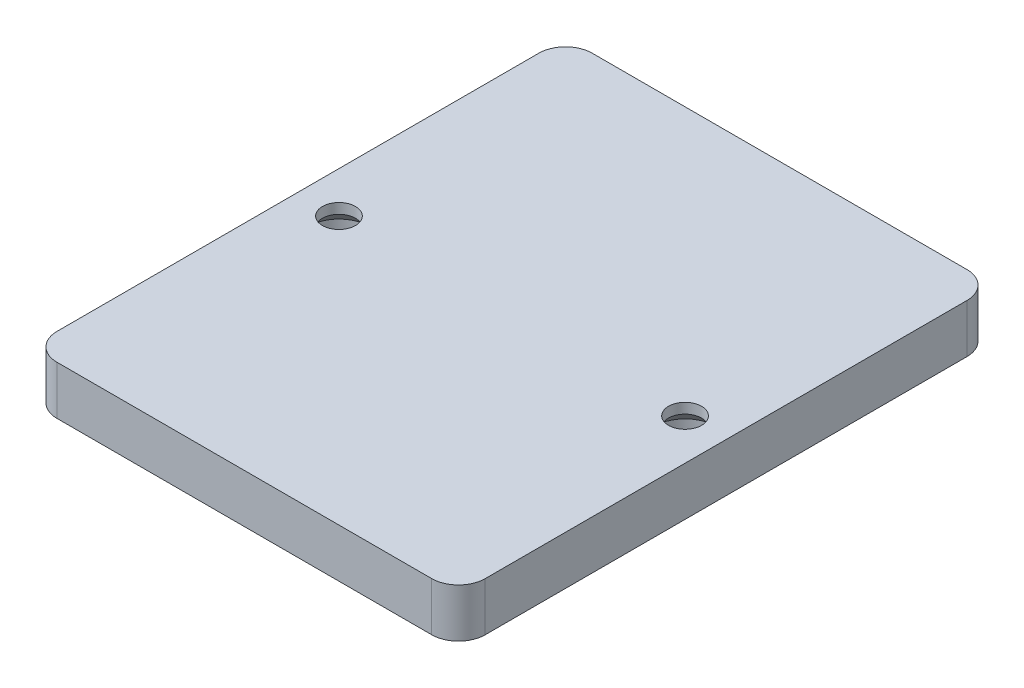
ISO-10303-21;
HEADER;
FILE_DESCRIPTION(('STEP AP214'),'2;1');
FILE_NAME('part.step','',(''),(''),'','','');
FILE_SCHEMA(('AUTOMOTIVE_DESIGN { 1 0 10303 214 1 1 1 1 }'));
ENDSEC;
DATA;
#1=APPLICATION_CONTEXT('core data for automotive mechanical design processes');
#2=APPLICATION_PROTOCOL_DEFINITION('international standard','automotive_design',2000,#1);
#3=PRODUCT_CONTEXT('',#1,'mechanical');
#4=PRODUCT('Part','Part','',(#3));
#5=PRODUCT_RELATED_PRODUCT_CATEGORY('part','',(#4));
#6=PRODUCT_DEFINITION_FORMATION('','',#4);
#7=PRODUCT_DEFINITION_CONTEXT('part definition',#1,'design');
#8=PRODUCT_DEFINITION('design','',#6,#7);
#9=PRODUCT_DEFINITION_SHAPE('','',#8);
#10=(LENGTH_UNIT() NAMED_UNIT(*) SI_UNIT(.MILLI.,.METRE.));
#11=(NAMED_UNIT(*) PLANE_ANGLE_UNIT() SI_UNIT($,.RADIAN.));
#12=(NAMED_UNIT(*) SI_UNIT($,.STERADIAN.) SOLID_ANGLE_UNIT());
#13=UNCERTAINTY_MEASURE_WITH_UNIT(LENGTH_MEASURE(1.E-05),#10,'distance_accuracy_value','');
#14=(GEOMETRIC_REPRESENTATION_CONTEXT(3) GLOBAL_UNCERTAINTY_ASSIGNED_CONTEXT((#13)) GLOBAL_UNIT_ASSIGNED_CONTEXT((#10,
#11,#12)) REPRESENTATION_CONTEXT('',''));
#15=CARTESIAN_POINT('',(0.,0.,0.));
#16=DIRECTION('',(0.,0.,1.));
#17=DIRECTION('',(1.,0.,0.));
#18=AXIS2_PLACEMENT_3D('',#15,#16,#17);
#19=CARTESIAN_POINT('',(-19.25,0.,24.75));
#20=DIRECTION('',(0.,-1.,0.));
#21=DIRECTION('',(0.,0.,-1.));
#22=AXIS2_PLACEMENT_3D('',#19,#20,#21);
#23=PLANE('',#22);
#24=CARTESIAN_POINT('',(-17.78,0.,0.));
#25=DIRECTION('',(0.,-1.,0.));
#26=DIRECTION('',(0.,0.,-1.));
#27=AXIS2_PLACEMENT_3D('',#24,#25,#26);
#28=CIRCLE('',#27,3.15);
#29=CARTESIAN_POINT('',(-17.78,0.,-3.15));
#30=VERTEX_POINT('',#29);
#31=EDGE_CURVE('E150',#30,#30,#28,.T.);
#32=ORIENTED_EDGE('',*,*,#31,.F.);
#33=EDGE_LOOP('',(#32));
#34=FACE_BOUND('',#33,.T.);
#35=CARTESIAN_POINT('',(-17.78,0.,0.));
#36=DIRECTION('',(0.,-1.,0.));
#37=DIRECTION('',(0.,0.,-1.));
#38=AXIS2_PLACEMENT_3D('',#35,#36,#37);
#39=CIRCLE('',#38,3.45);
#40=CARTESIAN_POINT('',(-17.78,0.,-3.45));
#41=VERTEX_POINT('',#40);
#42=EDGE_CURVE('E127',#41,#41,#39,.T.);
#43=ORIENTED_EDGE('',*,*,#42,.T.);
#44=EDGE_LOOP('',(#43));
#45=FACE_BOUND('',#44,.T.);
#46=ADVANCED_FACE('F35',(#34,#45),#23,.T.);
#47=CARTESIAN_POINT('',(17.78,0.,0.));
#48=DIRECTION('',(0.,-1.,0.));
#49=DIRECTION('',(0.,0.,-1.));
#50=AXIS2_PLACEMENT_3D('',#47,#48,#49);
#51=CIRCLE('',#50,3.15);
#52=CARTESIAN_POINT('',(17.78,0.,-3.15));
#53=VERTEX_POINT('',#52);
#54=EDGE_CURVE('E144',#53,#53,#51,.T.);
#55=ORIENTED_EDGE('',*,*,#54,.F.);
#56=EDGE_LOOP('',(#55));
#57=FACE_BOUND('',#56,.T.);
#58=CARTESIAN_POINT('',(17.78,0.,0.));
#59=DIRECTION('',(0.,-1.,0.));
#60=DIRECTION('',(0.,0.,-1.));
#61=AXIS2_PLACEMENT_3D('',#58,#59,#60);
#62=CIRCLE('',#61,3.45);
#63=CARTESIAN_POINT('',(17.78,0.,-3.45));
#64=VERTEX_POINT('',#63);
#65=EDGE_CURVE('E271',#64,#64,#62,.T.);
#66=ORIENTED_EDGE('',*,*,#65,.T.);
#67=EDGE_LOOP('',(#66));
#68=FACE_BOUND('',#67,.T.);
#69=ADVANCED_FACE('F200',(#57,#68),#23,.T.);
#70=CARTESIAN_POINT('',(-19.25,2.5,24.75));
#71=DIRECTION('',(0.,-1.,0.));
#72=DIRECTION('',(0.,0.,-1.));
#73=AXIS2_PLACEMENT_3D('',#70,#71,#72);
#74=PLANE('',#73);
#75=CARTESIAN_POINT('',(17.78,2.5,0.));
#76=DIRECTION('',(0.,-1.,0.));
#77=DIRECTION('',(0.,0.,-1.));
#78=AXIS2_PLACEMENT_3D('',#75,#76,#77);
#79=CIRCLE('',#78,1.69999999999999);
#80=CARTESIAN_POINT('',(17.78,2.5,-1.69999999999999));
#81=VERTEX_POINT('',#80);
#82=EDGE_CURVE('E39',#81,#81,#79,.T.);
#83=ORIENTED_EDGE('',*,*,#82,.T.);
#84=EDGE_LOOP('',(#83));
#85=FACE_BOUND('',#84,.T.);
#86=CARTESIAN_POINT('',(-17.78,2.5,0.));
#87=DIRECTION('',(0.,-1.,0.));
#88=DIRECTION('',(0.,0.,-1.));
#89=AXIS2_PLACEMENT_3D('',#86,#87,#88);
#90=CIRCLE('',#89,1.69999999999999);
#91=CARTESIAN_POINT('',(-17.78,2.5,-1.69999999999999));
#92=VERTEX_POINT('',#91);
#93=EDGE_CURVE('E156',#92,#92,#90,.T.);
#94=ORIENTED_EDGE('',*,*,#93,.T.);
#95=EDGE_LOOP('',(#94));
#96=FACE_BOUND('',#95,.T.);
#97=CARTESIAN_POINT('',(-19.25,2.5,24.75));
#98=DIRECTION('',(0.,1.,0.));
#99=DIRECTION('',(0.,0.,-1.));
#100=AXIS2_PLACEMENT_3D('',#97,#98,#99);
#101=CIRCLE('',#100,2.75);
#102=CARTESIAN_POINT('',(-22.,2.5,24.75));
#103=VERTEX_POINT('',#102);
#104=CARTESIAN_POINT('',(-19.25,2.5,27.5));
#105=VERTEX_POINT('',#104);
#106=EDGE_CURVE('E106',#103,#105,#101,.T.);
#107=ORIENTED_EDGE('',*,*,#106,.T.);
#108=DIRECTION('',(1.,0.,0.));
#109=VECTOR('',#108,1.);
#110=CARTESIAN_POINT('',(-19.25,2.5,27.5));
#111=LINE('',#110,#109);
#112=CARTESIAN_POINT('',(19.25,2.5,27.5));
#113=VERTEX_POINT('',#112);
#114=EDGE_CURVE('E158',#105,#113,#111,.T.);
#115=ORIENTED_EDGE('',*,*,#114,.T.);
#116=CARTESIAN_POINT('',(19.25,2.5,24.75));
#117=DIRECTION('',(0.,1.,0.));
#118=DIRECTION('',(0.,0.,1.));
#119=AXIS2_PLACEMENT_3D('',#116,#117,#118);
#120=CIRCLE('',#119,2.75);
#121=CARTESIAN_POINT('',(22.,2.5,24.75));
#122=VERTEX_POINT('',#121);
#123=EDGE_CURVE('E160',#113,#122,#120,.T.);
#124=ORIENTED_EDGE('',*,*,#123,.T.);
#125=DIRECTION('',(0.,0.,-1.));
#126=VECTOR('',#125,1.);
#127=CARTESIAN_POINT('',(22.,2.5,24.75));
#128=LINE('',#127,#126);
#129=CARTESIAN_POINT('',(22.,2.5,-24.75));
#130=VERTEX_POINT('',#129);
#131=EDGE_CURVE('E162',#122,#130,#128,.T.);
#132=ORIENTED_EDGE('',*,*,#131,.T.);
#133=CARTESIAN_POINT('',(19.25,2.5,-24.75));
#134=DIRECTION('',(0.,1.,0.));
#135=DIRECTION('',(0.,0.,-1.));
#136=AXIS2_PLACEMENT_3D('',#133,#134,#135);
#137=CIRCLE('',#136,2.75);
#138=CARTESIAN_POINT('',(19.25,2.5,-27.5));
#139=VERTEX_POINT('',#138);
#140=EDGE_CURVE('E164',#130,#139,#137,.T.);
#141=ORIENTED_EDGE('',*,*,#140,.T.);
#142=DIRECTION('',(-1.,0.,0.));
#143=VECTOR('',#142,1.);
#144=CARTESIAN_POINT('',(-19.25,2.5,-27.5));
#145=LINE('',#144,#143);
#146=CARTESIAN_POINT('',(-19.25,2.5,-27.5));
#147=VERTEX_POINT('',#146);
#148=EDGE_CURVE('E166',#139,#147,#145,.T.);
#149=ORIENTED_EDGE('',*,*,#148,.T.);
#150=CARTESIAN_POINT('',(-19.25,2.5,-24.75));
#151=DIRECTION('',(0.,1.,0.));
#152=DIRECTION('',(0.,0.,-1.));
#153=AXIS2_PLACEMENT_3D('',#150,#151,#152);
#154=CIRCLE('',#153,2.75);
#155=CARTESIAN_POINT('',(-22.,2.5,-24.75));
#156=VERTEX_POINT('',#155);
#157=EDGE_CURVE('E57',#147,#156,#154,.T.);
#158=ORIENTED_EDGE('',*,*,#157,.T.);
#159=DIRECTION('',(0.,0.,1.));
#160=VECTOR('',#159,1.);
#161=CARTESIAN_POINT('',(-22.,2.5,24.75));
#162=LINE('',#161,#160);
#163=EDGE_CURVE('E52',#156,#103,#162,.T.);
#164=ORIENTED_EDGE('',*,*,#163,.T.);
#165=EDGE_LOOP('',(#107,#115,#124,#132,#141,#149,#158,#164));
#166=FACE_BOUND('',#165,.T.);
#167=ADVANCED_FACE('F182',(#85,#96,#166),#74,.F.);
#168=CARTESIAN_POINT('',(-19.25,2.5,24.75));
#169=DIRECTION('',(0.,-1.,0.));
#170=DIRECTION('',(0.,0.,-1.));
#171=AXIS2_PLACEMENT_3D('',#168,#169,#170);
#172=CYLINDRICAL_SURFACE('',#171,2.75);
#173=DIRECTION('',(0.,-1.,0.));
#174=VECTOR('',#173,1.);
#175=CARTESIAN_POINT('',(-22.,2.5,24.75));
#176=LINE('',#175,#174);
#177=CARTESIAN_POINT('',(-22.,-2.5,24.75));
#178=VERTEX_POINT('',#177);
#179=EDGE_CURVE('E101',#103,#178,#176,.T.);
#180=ORIENTED_EDGE('',*,*,#179,.T.);
#181=CARTESIAN_POINT('',(-19.25,-2.5,24.75));
#182=DIRECTION('',(0.,-1.,0.));
#183=DIRECTION('',(0.,0.,-1.));
#184=AXIS2_PLACEMENT_3D('',#181,#182,#183);
#185=CIRCLE('',#184,2.75);
#186=CARTESIAN_POINT('',(-19.25,-2.5,27.5));
#187=VERTEX_POINT('',#186);
#188=EDGE_CURVE('E105',#187,#178,#185,.T.);
#189=ORIENTED_EDGE('',*,*,#188,.F.);
#190=DIRECTION('',(0.,-1.,0.));
#191=VECTOR('',#190,1.);
#192=CARTESIAN_POINT('',(-19.25,2.5,27.5));
#193=LINE('',#192,#191);
#194=EDGE_CURVE('E11',#105,#187,#193,.T.);
#195=ORIENTED_EDGE('',*,*,#194,.F.);
#196=ORIENTED_EDGE('',*,*,#106,.F.);
#197=EDGE_LOOP('',(#180,#189,#195,#196));
#198=FACE_BOUND('',#197,.T.);
#199=ADVANCED_FACE('F37',(#198),#172,.T.);
#200=CARTESIAN_POINT('',(-19.25,2.5,27.5));
#201=DIRECTION('',(0.,0.,-1.));
#202=DIRECTION('',(-1.,0.,0.));
#203=AXIS2_PLACEMENT_3D('',#200,#201,#202);
#204=PLANE('',#203);
#205=ORIENTED_EDGE('',*,*,#194,.T.);
#206=DIRECTION('',(-1.,0.,0.));
#207=VECTOR('',#206,1.);
#208=CARTESIAN_POINT('',(19.25,-2.5,27.5));
#209=LINE('',#208,#207);
#210=CARTESIAN_POINT('',(19.25,-2.5,27.5));
#211=VERTEX_POINT('',#210);
#212=EDGE_CURVE('E123',#211,#187,#209,.T.);
#213=ORIENTED_EDGE('',*,*,#212,.F.);
#214=DIRECTION('',(0.,-1.,0.));
#215=VECTOR('',#214,1.);
#216=CARTESIAN_POINT('',(19.25,2.5,27.5));
#217=LINE('',#216,#215);
#218=EDGE_CURVE('E44',#113,#211,#217,.T.);
#219=ORIENTED_EDGE('',*,*,#218,.F.);
#220=ORIENTED_EDGE('',*,*,#114,.F.);
#221=EDGE_LOOP('',(#205,#213,#219,#220));
#222=FACE_BOUND('',#221,.T.);
#223=ADVANCED_FACE('F227',(#222),#204,.F.);
#224=CARTESIAN_POINT('',(19.25,2.5,24.75));
#225=DIRECTION('',(0.,-1.,0.));
#226=DIRECTION('',(0.,0.,-1.));
#227=AXIS2_PLACEMENT_3D('',#224,#225,#226);
#228=CYLINDRICAL_SURFACE('',#227,2.75);
#229=ORIENTED_EDGE('',*,*,#218,.T.);
#230=CARTESIAN_POINT('',(19.25,-2.5,24.75));
#231=DIRECTION('',(0.,-1.,0.));
#232=DIRECTION('',(0.,0.,-1.));
#233=AXIS2_PLACEMENT_3D('',#230,#231,#232);
#234=CIRCLE('',#233,2.75);
#235=CARTESIAN_POINT('',(22.,-2.5,24.75));
#236=VERTEX_POINT('',#235);
#237=EDGE_CURVE('E141',#236,#211,#234,.T.);
#238=ORIENTED_EDGE('',*,*,#237,.F.);
#239=DIRECTION('',(0.,-1.,0.));
#240=VECTOR('',#239,1.);
#241=CARTESIAN_POINT('',(22.,2.5,24.75));
#242=LINE('',#241,#240);
#243=EDGE_CURVE('E177',#122,#236,#242,.T.);
#244=ORIENTED_EDGE('',*,*,#243,.F.);
#245=ORIENTED_EDGE('',*,*,#123,.F.);
#246=EDGE_LOOP('',(#229,#238,#244,#245));
#247=FACE_BOUND('',#246,.T.);
#248=ADVANCED_FACE('F224',(#247),#228,.T.);
#249=CARTESIAN_POINT('',(22.,2.5,24.75));
#250=DIRECTION('',(-1.,0.,0.));
#251=DIRECTION('',(0.,0.,1.));
#252=AXIS2_PLACEMENT_3D('',#249,#250,#251);
#253=PLANE('',#252);
#254=ORIENTED_EDGE('',*,*,#243,.T.);
#255=DIRECTION('',(0.,0.,1.));
#256=VECTOR('',#255,1.);
#257=CARTESIAN_POINT('',(22.,-2.5,-24.75));
#258=LINE('',#257,#256);
#259=CARTESIAN_POINT('',(22.,-2.5,-24.75));
#260=VERTEX_POINT('',#259);
#261=EDGE_CURVE('E138',#260,#236,#258,.T.);
#262=ORIENTED_EDGE('',*,*,#261,.F.);
#263=DIRECTION('',(0.,-1.,0.));
#264=VECTOR('',#263,1.);
#265=CARTESIAN_POINT('',(22.,2.5,-24.75));
#266=LINE('',#265,#264);
#267=EDGE_CURVE('E175',#130,#260,#266,.T.);
#268=ORIENTED_EDGE('',*,*,#267,.F.);
#269=ORIENTED_EDGE('',*,*,#131,.F.);
#270=EDGE_LOOP('',(#254,#262,#268,#269));
#271=FACE_BOUND('',#270,.T.);
#272=ADVANCED_FACE('F220',(#271),#253,.F.);
#273=CARTESIAN_POINT('',(19.25,2.5,-24.75));
#274=DIRECTION('',(0.,-1.,0.));
#275=DIRECTION('',(0.,0.,-1.));
#276=AXIS2_PLACEMENT_3D('',#273,#274,#275);
#277=CYLINDRICAL_SURFACE('',#276,2.75);
#278=ORIENTED_EDGE('',*,*,#267,.T.);
#279=CARTESIAN_POINT('',(19.25,-2.5,-24.75));
#280=DIRECTION('',(0.,-1.,0.));
#281=DIRECTION('',(0.,0.,-1.));
#282=AXIS2_PLACEMENT_3D('',#279,#280,#281);
#283=CIRCLE('',#282,2.75);
#284=CARTESIAN_POINT('',(19.25,-2.5,-27.5));
#285=VERTEX_POINT('',#284);
#286=EDGE_CURVE('E135',#285,#260,#283,.T.);
#287=ORIENTED_EDGE('',*,*,#286,.F.);
#288=DIRECTION('',(0.,-1.,0.));
#289=VECTOR('',#288,1.);
#290=CARTESIAN_POINT('',(19.25,2.5,-27.5));
#291=LINE('',#290,#289);
#292=EDGE_CURVE('E173',#139,#285,#291,.T.);
#293=ORIENTED_EDGE('',*,*,#292,.F.);
#294=ORIENTED_EDGE('',*,*,#140,.F.);
#295=EDGE_LOOP('',(#278,#287,#293,#294));
#296=FACE_BOUND('',#295,.T.);
#297=ADVANCED_FACE('F216',(#296),#277,.T.);
#298=CARTESIAN_POINT('',(-19.25,2.5,-27.5));
#299=DIRECTION('',(0.,0.,1.));
#300=DIRECTION('',(1.,0.,0.));
#301=AXIS2_PLACEMENT_3D('',#298,#299,#300);
#302=PLANE('',#301);
#303=ORIENTED_EDGE('',*,*,#292,.T.);
#304=DIRECTION('',(1.,0.,0.));
#305=VECTOR('',#304,1.);
#306=CARTESIAN_POINT('',(-19.25,-2.5,-27.5));
#307=LINE('',#306,#305);
#308=CARTESIAN_POINT('',(-19.25,-2.5,-27.5));
#309=VERTEX_POINT('',#308);
#310=EDGE_CURVE('E132',#309,#285,#307,.T.);
#311=ORIENTED_EDGE('',*,*,#310,.F.);
#312=DIRECTION('',(0.,-1.,0.));
#313=VECTOR('',#312,1.);
#314=CARTESIAN_POINT('',(-19.25,2.5,-27.5));
#315=LINE('',#314,#313);
#316=EDGE_CURVE('E171',#147,#309,#315,.T.);
#317=ORIENTED_EDGE('',*,*,#316,.F.);
#318=ORIENTED_EDGE('',*,*,#148,.F.);
#319=EDGE_LOOP('',(#303,#311,#317,#318));
#320=FACE_BOUND('',#319,.T.);
#321=ADVANCED_FACE('F212',(#320),#302,.F.);
#322=CARTESIAN_POINT('',(-19.25,2.5,-24.75));
#323=DIRECTION('',(0.,-1.,0.));
#324=DIRECTION('',(0.,0.,-1.));
#325=AXIS2_PLACEMENT_3D('',#322,#323,#324);
#326=CYLINDRICAL_SURFACE('',#325,2.75);
#327=ORIENTED_EDGE('',*,*,#316,.T.);
#328=CARTESIAN_POINT('',(-19.25,-2.5,-24.75));
#329=DIRECTION('',(0.,-1.,0.));
#330=DIRECTION('',(0.,0.,-1.));
#331=AXIS2_PLACEMENT_3D('',#328,#329,#330);
#332=CIRCLE('',#331,2.75);
#333=CARTESIAN_POINT('',(-22.,-2.5,-24.75));
#334=VERTEX_POINT('',#333);
#335=EDGE_CURVE('E116',#334,#309,#332,.T.);
#336=ORIENTED_EDGE('',*,*,#335,.F.);
#337=DIRECTION('',(0.,-1.,0.));
#338=VECTOR('',#337,1.);
#339=CARTESIAN_POINT('',(-22.,2.5,-24.75));
#340=LINE('',#339,#338);
#341=EDGE_CURVE('E108',#156,#334,#340,.T.);
#342=ORIENTED_EDGE('',*,*,#341,.F.);
#343=ORIENTED_EDGE('',*,*,#157,.F.);
#344=EDGE_LOOP('',(#327,#336,#342,#343));
#345=FACE_BOUND('',#344,.T.);
#346=ADVANCED_FACE('F196',(#345),#326,.T.);
#347=CARTESIAN_POINT('',(-22.,2.5,24.75));
#348=DIRECTION('',(1.,0.,0.));
#349=DIRECTION('',(0.,0.,-1.));
#350=AXIS2_PLACEMENT_3D('',#347,#348,#349);
#351=PLANE('',#350);
#352=ORIENTED_EDGE('',*,*,#341,.T.);
#353=DIRECTION('',(0.,0.,-1.));
#354=VECTOR('',#353,1.);
#355=CARTESIAN_POINT('',(-22.,-2.5,24.75));
#356=LINE('',#355,#354);
#357=EDGE_CURVE('E111',#178,#334,#356,.T.);
#358=ORIENTED_EDGE('',*,*,#357,.F.);
#359=ORIENTED_EDGE('',*,*,#179,.F.);
#360=ORIENTED_EDGE('',*,*,#163,.F.);
#361=EDGE_LOOP('',(#352,#358,#359,#360));
#362=FACE_BOUND('',#361,.T.);
#363=ADVANCED_FACE('F112',(#362),#351,.F.);
#364=CARTESIAN_POINT('',(-17.78,0.,0.));
#365=DIRECTION('',(0.,-1.,0.));
#366=DIRECTION('',(0.,0.,-1.));
#367=AXIS2_PLACEMENT_3D('',#364,#365,#366);
#368=CYLINDRICAL_SURFACE('',#367,1.69999999999999);
#369=CARTESIAN_POINT('',(-17.78,1.45,0.));
#370=DIRECTION('',(0.,-1.,0.));
#371=DIRECTION('',(0.,0.,-1.));
#372=AXIS2_PLACEMENT_3D('',#369,#370,#371);
#373=CIRCLE('',#372,1.7);
#374=CARTESIAN_POINT('',(-17.78,1.45,-1.7));
#375=VERTEX_POINT('',#374);
#376=EDGE_CURVE('E153',#375,#375,#373,.T.);
#377=ORIENTED_EDGE('',*,*,#376,.T.);
#378=EDGE_LOOP('',(#377));
#379=FACE_BOUND('',#378,.T.);
#380=ORIENTED_EDGE('',*,*,#93,.F.);
#381=EDGE_LOOP('',(#380));
#382=FACE_BOUND('',#381,.T.);
#383=ADVANCED_FACE('F184',(#379,#382),#368,.F.);
#384=CARTESIAN_POINT('',(-17.78,0.,0.));
#385=DIRECTION('',(0.,-1.,0.));
#386=DIRECTION('',(0.,0.,-1.));
#387=AXIS2_PLACEMENT_3D('',#384,#385,#386);
#388=CONICAL_SURFACE('',#387,3.15,0.785398163397449);
#389=ORIENTED_EDGE('',*,*,#376,.F.);
#390=EDGE_LOOP('',(#389));
#391=FACE_BOUND('',#390,.T.);
#392=ORIENTED_EDGE('',*,*,#31,.T.);
#393=EDGE_LOOP('',(#392));
#394=FACE_BOUND('',#393,.T.);
#395=ADVANCED_FACE('F186',(#391,#394),#388,.F.);
#396=CARTESIAN_POINT('',(17.78,0.,0.));
#397=DIRECTION('',(0.,-1.,0.));
#398=DIRECTION('',(0.,0.,-1.));
#399=AXIS2_PLACEMENT_3D('',#396,#397,#398);
#400=CYLINDRICAL_SURFACE('',#399,1.69999999999999);
#401=CARTESIAN_POINT('',(17.78,1.45,0.));
#402=DIRECTION('',(0.,-1.,0.));
#403=DIRECTION('',(0.,0.,-1.));
#404=AXIS2_PLACEMENT_3D('',#401,#402,#403);
#405=CIRCLE('',#404,1.7);
#406=CARTESIAN_POINT('',(17.78,1.45,-1.7));
#407=VERTEX_POINT('',#406);
#408=EDGE_CURVE('E147',#407,#407,#405,.T.);
#409=ORIENTED_EDGE('',*,*,#408,.T.);
#410=EDGE_LOOP('',(#409));
#411=FACE_BOUND('',#410,.T.);
#412=ORIENTED_EDGE('',*,*,#82,.F.);
#413=EDGE_LOOP('',(#412));
#414=FACE_BOUND('',#413,.T.);
#415=ADVANCED_FACE('F193',(#411,#414),#400,.F.);
#416=CARTESIAN_POINT('',(17.78,0.,0.));
#417=DIRECTION('',(0.,-1.,0.));
#418=DIRECTION('',(0.,0.,-1.));
#419=AXIS2_PLACEMENT_3D('',#416,#417,#418);
#420=CONICAL_SURFACE('',#419,3.15,0.785398163397449);
#421=ORIENTED_EDGE('',*,*,#408,.F.);
#422=EDGE_LOOP('',(#421));
#423=FACE_BOUND('',#422,.T.);
#424=ORIENTED_EDGE('',*,*,#54,.T.);
#425=EDGE_LOOP('',(#424));
#426=FACE_BOUND('',#425,.T.);
#427=ADVANCED_FACE('F244',(#423,#426),#420,.F.);
#428=CARTESIAN_POINT('',(-19.25,-2.5,24.75));
#429=DIRECTION('',(0.,-1.,0.));
#430=DIRECTION('',(0.,0.,-1.));
#431=AXIS2_PLACEMENT_3D('',#428,#429,#430);
#432=PLANE('',#431);
#433=CARTESIAN_POINT('',(-17.78,-2.5,0.));
#434=DIRECTION('',(0.,-1.,0.));
#435=DIRECTION('',(0.,0.,-1.));
#436=AXIS2_PLACEMENT_3D('',#433,#434,#435);
#437=CIRCLE('',#436,3.45);
#438=CARTESIAN_POINT('',(-17.78,-2.5,-3.45));
#439=VERTEX_POINT('',#438);
#440=EDGE_CURVE('E124',#439,#439,#437,.T.);
#441=ORIENTED_EDGE('',*,*,#440,.F.);
#442=EDGE_LOOP('',(#441));
#443=FACE_BOUND('',#442,.T.);
#444=ORIENTED_EDGE('',*,*,#188,.T.);
#445=ORIENTED_EDGE('',*,*,#357,.T.);
#446=ORIENTED_EDGE('',*,*,#335,.T.);
#447=ORIENTED_EDGE('',*,*,#310,.T.);
#448=ORIENTED_EDGE('',*,*,#286,.T.);
#449=ORIENTED_EDGE('',*,*,#261,.T.);
#450=ORIENTED_EDGE('',*,*,#237,.T.);
#451=ORIENTED_EDGE('',*,*,#212,.T.);
#452=EDGE_LOOP('',(#444,#445,#446,#447,#448,#449,#450,#451));
#453=FACE_BOUND('',#452,.T.);
#454=CARTESIAN_POINT('',(17.78,-2.5,0.));
#455=DIRECTION('',(0.,-1.,0.));
#456=DIRECTION('',(0.,0.,-1.));
#457=AXIS2_PLACEMENT_3D('',#454,#455,#456);
#458=CIRCLE('',#457,3.45);
#459=CARTESIAN_POINT('',(17.78,-2.5,-3.45));
#460=VERTEX_POINT('',#459);
#461=EDGE_CURVE('E268',#460,#460,#458,.T.);
#462=ORIENTED_EDGE('',*,*,#461,.F.);
#463=EDGE_LOOP('',(#462));
#464=FACE_BOUND('',#463,.T.);
#465=ADVANCED_FACE('F119',(#443,#453,#464),#432,.T.);
#466=CARTESIAN_POINT('',(-17.78,-2.5,0.));
#467=DIRECTION('',(0.,1.,0.));
#468=DIRECTION('',(0.,0.,1.));
#469=AXIS2_PLACEMENT_3D('',#466,#467,#468);
#470=CYLINDRICAL_SURFACE('',#469,3.45);
#471=ORIENTED_EDGE('',*,*,#440,.T.);
#472=EDGE_LOOP('',(#471));
#473=FACE_BOUND('',#472,.T.);
#474=ORIENTED_EDGE('',*,*,#42,.F.);
#475=EDGE_LOOP('',(#474));
#476=FACE_BOUND('',#475,.T.);
#477=ADVANCED_FACE('F255',(#473,#476),#470,.F.);
#478=CARTESIAN_POINT('',(17.78,-2.5,0.));
#479=DIRECTION('',(0.,1.,0.));
#480=DIRECTION('',(0.,0.,1.));
#481=AXIS2_PLACEMENT_3D('',#478,#479,#480);
#482=CYLINDRICAL_SURFACE('',#481,3.45);
#483=ORIENTED_EDGE('',*,*,#461,.T.);
#484=EDGE_LOOP('',(#483));
#485=FACE_BOUND('',#484,.T.);
#486=ORIENTED_EDGE('',*,*,#65,.F.);
#487=EDGE_LOOP('',(#486));
#488=FACE_BOUND('',#487,.T.);
#489=ADVANCED_FACE('F259',(#485,#488),#482,.F.);
#490=CLOSED_SHELL('',(#46,#69,#167,#199,#223,#248,#272,#297,#321,#346,#363,#383,#395,#415,#427,
#465,#477,#489));
#491=MANIFOLD_SOLID_BREP('B2',#490);
#492=ADVANCED_BREP_SHAPE_REPRESENTATION('',(#18,#491),#14);
#493=SHAPE_DEFINITION_REPRESENTATION(#9,#492);
ENDSEC;
END-ISO-10303-21;
